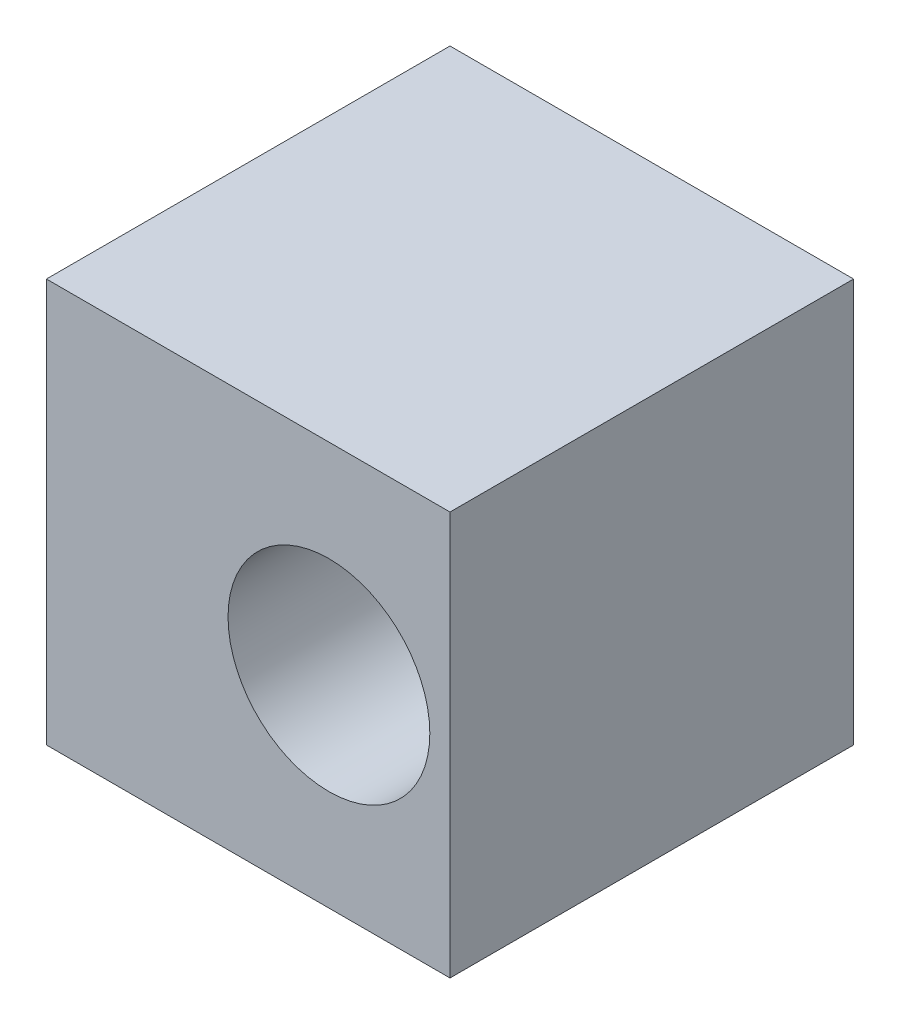
ISO-10303-21;
HEADER;
FILE_DESCRIPTION(('STEP AP214'),'2;1');
FILE_NAME('part.step','',(''),(''),'','','');
FILE_SCHEMA(('AUTOMOTIVE_DESIGN { 1 0 10303 214 1 1 1 1 }'));
ENDSEC;
DATA;
#1=APPLICATION_CONTEXT('core data for automotive mechanical design processes');
#2=APPLICATION_PROTOCOL_DEFINITION('international standard','automotive_design',2000,#1);
#3=PRODUCT_CONTEXT('',#1,'mechanical');
#4=PRODUCT('Part','Part','',(#3));
#5=PRODUCT_RELATED_PRODUCT_CATEGORY('part','',(#4));
#6=PRODUCT_DEFINITION_FORMATION('','',#4);
#7=PRODUCT_DEFINITION_CONTEXT('part definition',#1,'design');
#8=PRODUCT_DEFINITION('design','',#6,#7);
#9=PRODUCT_DEFINITION_SHAPE('','',#8);
#10=(LENGTH_UNIT() NAMED_UNIT(*) SI_UNIT(.MILLI.,.METRE.));
#11=(NAMED_UNIT(*) PLANE_ANGLE_UNIT() SI_UNIT($,.RADIAN.));
#12=(NAMED_UNIT(*) SI_UNIT($,.STERADIAN.) SOLID_ANGLE_UNIT());
#13=UNCERTAINTY_MEASURE_WITH_UNIT(LENGTH_MEASURE(1.E-05),#10,'distance_accuracy_value','');
#14=(GEOMETRIC_REPRESENTATION_CONTEXT(3) GLOBAL_UNCERTAINTY_ASSIGNED_CONTEXT((#13)) GLOBAL_UNIT_ASSIGNED_CONTEXT((#10,
#11,#12)) REPRESENTATION_CONTEXT('',''));
#15=CARTESIAN_POINT('',(0.,0.,0.));
#16=DIRECTION('',(0.,0.,1.));
#17=DIRECTION('',(1.,0.,0.));
#18=AXIS2_PLACEMENT_3D('',#15,#16,#17);
#19=CARTESIAN_POINT('',(0.,10.,10.));
#20=DIRECTION('',(0.,0.,-1.));
#21=DIRECTION('',(-1.,0.,0.));
#22=AXIS2_PLACEMENT_3D('',#19,#20,#21);
#23=PLANE('',#22);
#24=DIRECTION('',(0.,-1.,0.));
#25=VECTOR('',#24,1.);
#26=CARTESIAN_POINT('',(0.,0.,10.));
#27=LINE('',#26,#25);
#28=CARTESIAN_POINT('',(0.,10.,10.));
#29=VERTEX_POINT('',#28);
#30=CARTESIAN_POINT('',(0.,0.,10.));
#31=VERTEX_POINT('',#30);
#32=EDGE_CURVE('E87',#29,#31,#27,.T.);
#33=ORIENTED_EDGE('',*,*,#32,.T.);
#34=DIRECTION('',(1.,0.,0.));
#35=VECTOR('',#34,1.);
#36=CARTESIAN_POINT('',(0.,0.,10.));
#37=LINE('',#36,#35);
#38=CARTESIAN_POINT('',(10.,0.,10.));
#39=VERTEX_POINT('',#38);
#40=EDGE_CURVE('E82',#31,#39,#37,.T.);
#41=ORIENTED_EDGE('',*,*,#40,.T.);
#42=DIRECTION('',(0.,1.,0.));
#43=VECTOR('',#42,1.);
#44=CARTESIAN_POINT('',(10.,0.,10.));
#45=LINE('',#44,#43);
#46=CARTESIAN_POINT('',(10.,10.,10.));
#47=VERTEX_POINT('',#46);
#48=EDGE_CURVE('E85',#39,#47,#45,.T.);
#49=ORIENTED_EDGE('',*,*,#48,.T.);
#50=DIRECTION('',(-1.,0.,0.));
#51=VECTOR('',#50,1.);
#52=CARTESIAN_POINT('',(0.,10.,10.));
#53=LINE('',#52,#51);
#54=EDGE_CURVE('E52',#47,#29,#53,.T.);
#55=ORIENTED_EDGE('',*,*,#54,.T.);
#56=EDGE_LOOP('',(#33,#41,#49,#55));
#57=FACE_BOUND('',#56,.T.);
#58=CARTESIAN_POINT('',(7.,5.,10.));
#59=DIRECTION('',(0.,0.,1.));
#60=DIRECTION('',(1.,0.,0.));
#61=AXIS2_PLACEMENT_3D('',#58,#59,#60);
#62=CIRCLE('',#61,2.5);
#63=CARTESIAN_POINT('',(9.5,5.,10.));
#64=VERTEX_POINT('',#63);
#65=EDGE_CURVE('E102',#64,#64,#62,.T.);
#66=ORIENTED_EDGE('',*,*,#65,.F.);
#67=EDGE_LOOP('',(#66));
#68=FACE_BOUND('',#67,.T.);
#69=ADVANCED_FACE('F35',(#57,#68),#23,.F.);
#70=CARTESIAN_POINT('',(0.,10.,0.));
#71=DIRECTION('',(0.,0.,-1.));
#72=DIRECTION('',(-1.,0.,0.));
#73=AXIS2_PLACEMENT_3D('',#70,#71,#72);
#74=PLANE('',#73);
#75=DIRECTION('',(0.,-1.,0.));
#76=VECTOR('',#75,1.);
#77=CARTESIAN_POINT('',(0.,0.,0.));
#78=LINE('',#77,#76);
#79=CARTESIAN_POINT('',(0.,10.,0.));
#80=VERTEX_POINT('',#79);
#81=CARTESIAN_POINT('',(0.,0.,0.));
#82=VERTEX_POINT('',#81);
#83=EDGE_CURVE('E99',#80,#82,#78,.T.);
#84=ORIENTED_EDGE('',*,*,#83,.F.);
#85=DIRECTION('',(-1.,0.,0.));
#86=VECTOR('',#85,1.);
#87=CARTESIAN_POINT('',(0.,10.,0.));
#88=LINE('',#87,#86);
#89=CARTESIAN_POINT('',(10.,10.,0.));
#90=VERTEX_POINT('',#89);
#91=EDGE_CURVE('E75',#90,#80,#88,.T.);
#92=ORIENTED_EDGE('',*,*,#91,.F.);
#93=DIRECTION('',(0.,1.,0.));
#94=VECTOR('',#93,1.);
#95=CARTESIAN_POINT('',(10.,0.,0.));
#96=LINE('',#95,#94);
#97=CARTESIAN_POINT('',(10.,0.,0.));
#98=VERTEX_POINT('',#97);
#99=EDGE_CURVE('E69',#98,#90,#96,.T.);
#100=ORIENTED_EDGE('',*,*,#99,.F.);
#101=DIRECTION('',(1.,0.,0.));
#102=VECTOR('',#101,1.);
#103=CARTESIAN_POINT('',(0.,0.,0.));
#104=LINE('',#103,#102);
#105=EDGE_CURVE('E91',#82,#98,#104,.T.);
#106=ORIENTED_EDGE('',*,*,#105,.F.);
#107=EDGE_LOOP('',(#84,#92,#100,#106));
#108=FACE_BOUND('',#107,.T.);
#109=CARTESIAN_POINT('',(7.,5.,0.));
#110=DIRECTION('',(0.,0.,1.));
#111=DIRECTION('',(1.,0.,0.));
#112=AXIS2_PLACEMENT_3D('',#109,#110,#111);
#113=CIRCLE('',#112,2.5);
#114=CARTESIAN_POINT('',(9.5,5.,0.));
#115=VERTEX_POINT('',#114);
#116=EDGE_CURVE('E114',#115,#115,#113,.T.);
#117=ORIENTED_EDGE('',*,*,#116,.T.);
#118=EDGE_LOOP('',(#117));
#119=FACE_BOUND('',#118,.T.);
#120=ADVANCED_FACE('F110',(#108,#119),#74,.T.);
#121=CARTESIAN_POINT('',(0.,0.,10.));
#122=DIRECTION('',(1.,0.,0.));
#123=DIRECTION('',(0.,0.,-1.));
#124=AXIS2_PLACEMENT_3D('',#121,#122,#123);
#125=PLANE('',#124);
#126=ORIENTED_EDGE('',*,*,#83,.T.);
#127=DIRECTION('',(0.,0.,-1.));
#128=VECTOR('',#127,1.);
#129=CARTESIAN_POINT('',(0.,0.,10.));
#130=LINE('',#129,#128);
#131=EDGE_CURVE('E11',#31,#82,#130,.T.);
#132=ORIENTED_EDGE('',*,*,#131,.F.);
#133=ORIENTED_EDGE('',*,*,#32,.F.);
#134=DIRECTION('',(0.,0.,-1.));
#135=VECTOR('',#134,1.);
#136=CARTESIAN_POINT('',(0.,10.,10.));
#137=LINE('',#136,#135);
#138=EDGE_CURVE('E95',#29,#80,#137,.T.);
#139=ORIENTED_EDGE('',*,*,#138,.T.);
#140=EDGE_LOOP('',(#126,#132,#133,#139));
#141=FACE_BOUND('',#140,.T.);
#142=ADVANCED_FACE('F37',(#141),#125,.F.);
#143=CARTESIAN_POINT('',(0.,0.,10.));
#144=DIRECTION('',(0.,1.,0.));
#145=DIRECTION('',(0.,0.,1.));
#146=AXIS2_PLACEMENT_3D('',#143,#144,#145);
#147=PLANE('',#146);
#148=ORIENTED_EDGE('',*,*,#105,.T.);
#149=DIRECTION('',(0.,0.,-1.));
#150=VECTOR('',#149,1.);
#151=CARTESIAN_POINT('',(10.,0.,10.));
#152=LINE('',#151,#150);
#153=EDGE_CURVE('E44',#39,#98,#152,.T.);
#154=ORIENTED_EDGE('',*,*,#153,.F.);
#155=ORIENTED_EDGE('',*,*,#40,.F.);
#156=ORIENTED_EDGE('',*,*,#131,.T.);
#157=EDGE_LOOP('',(#148,#154,#155,#156));
#158=FACE_BOUND('',#157,.T.);
#159=ADVANCED_FACE('F90',(#158),#147,.F.);
#160=CARTESIAN_POINT('',(10.,0.,10.));
#161=DIRECTION('',(-1.,0.,0.));
#162=DIRECTION('',(0.,0.,1.));
#163=AXIS2_PLACEMENT_3D('',#160,#161,#162);
#164=PLANE('',#163);
#165=ORIENTED_EDGE('',*,*,#99,.T.);
#166=DIRECTION('',(0.,0.,-1.));
#167=VECTOR('',#166,1.);
#168=CARTESIAN_POINT('',(10.,10.,10.));
#169=LINE('',#168,#167);
#170=EDGE_CURVE('E92',#47,#90,#169,.T.);
#171=ORIENTED_EDGE('',*,*,#170,.F.);
#172=ORIENTED_EDGE('',*,*,#48,.F.);
#173=ORIENTED_EDGE('',*,*,#153,.T.);
#174=EDGE_LOOP('',(#165,#171,#172,#173));
#175=FACE_BOUND('',#174,.T.);
#176=ADVANCED_FACE('F93',(#175),#164,.F.);
#177=CARTESIAN_POINT('',(0.,10.,10.));
#178=DIRECTION('',(0.,-1.,0.));
#179=DIRECTION('',(0.,0.,-1.));
#180=AXIS2_PLACEMENT_3D('',#177,#178,#179);
#181=PLANE('',#180);
#182=ORIENTED_EDGE('',*,*,#91,.T.);
#183=ORIENTED_EDGE('',*,*,#138,.F.);
#184=ORIENTED_EDGE('',*,*,#54,.F.);
#185=ORIENTED_EDGE('',*,*,#170,.T.);
#186=EDGE_LOOP('',(#182,#183,#184,#185));
#187=FACE_BOUND('',#186,.T.);
#188=ADVANCED_FACE('F107',(#187),#181,.F.);
#189=CARTESIAN_POINT('',(7.,5.,10.));
#190=DIRECTION('',(0.,0.,-1.));
#191=DIRECTION('',(-1.,0.,0.));
#192=AXIS2_PLACEMENT_3D('',#189,#190,#191);
#193=CYLINDRICAL_SURFACE('',#192,2.5);
#194=ORIENTED_EDGE('',*,*,#65,.T.);
#195=EDGE_LOOP('',(#194));
#196=FACE_BOUND('',#195,.T.);
#197=ORIENTED_EDGE('',*,*,#116,.F.);
#198=EDGE_LOOP('',(#197));
#199=FACE_BOUND('',#198,.T.);
#200=ADVANCED_FACE('F120',(#196,#199),#193,.F.);
#201=CLOSED_SHELL('',(#69,#120,#142,#159,#176,#188,#200));
#202=MANIFOLD_SOLID_BREP('B2',#201);
#203=ADVANCED_BREP_SHAPE_REPRESENTATION('',(#18,#202),#14);
#204=SHAPE_DEFINITION_REPRESENTATION(#9,#203);
ENDSEC;
END-ISO-10303-21;
